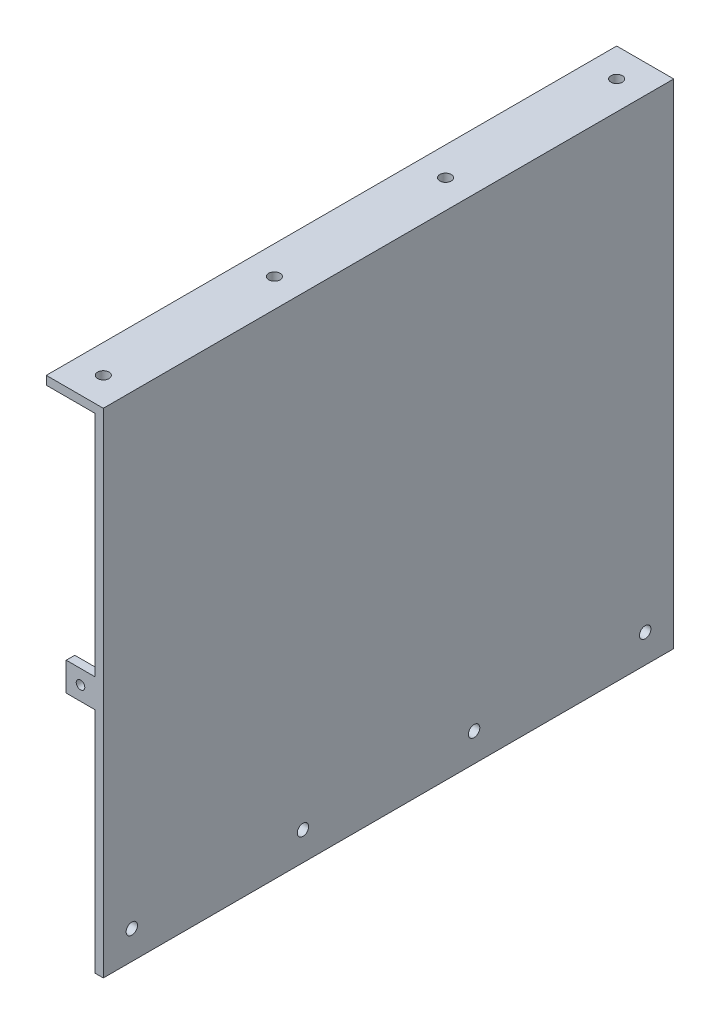
ISO-10303-21;
HEADER;
FILE_DESCRIPTION(('STEP AP214'),'2;1');
FILE_NAME('part.step','',(''),(''),'','','');
FILE_SCHEMA(('AUTOMOTIVE_DESIGN { 1 0 10303 214 1 1 1 1 }'));
ENDSEC;
DATA;
#1=APPLICATION_CONTEXT('core data for automotive mechanical design processes');
#2=APPLICATION_PROTOCOL_DEFINITION('international standard','automotive_design',2000,#1);
#3=PRODUCT_CONTEXT('',#1,'mechanical');
#4=PRODUCT('Part','Part','',(#3));
#5=PRODUCT_RELATED_PRODUCT_CATEGORY('part','',(#4));
#6=PRODUCT_DEFINITION_FORMATION('','',#4);
#7=PRODUCT_DEFINITION_CONTEXT('part definition',#1,'design');
#8=PRODUCT_DEFINITION('design','',#6,#7);
#9=PRODUCT_DEFINITION_SHAPE('','',#8);
#10=(LENGTH_UNIT() NAMED_UNIT(*) SI_UNIT(.MILLI.,.METRE.));
#11=(NAMED_UNIT(*) PLANE_ANGLE_UNIT() SI_UNIT($,.RADIAN.));
#12=(NAMED_UNIT(*) SI_UNIT($,.STERADIAN.) SOLID_ANGLE_UNIT());
#13=UNCERTAINTY_MEASURE_WITH_UNIT(LENGTH_MEASURE(1.E-05),#10,'distance_accuracy_value','');
#14=(GEOMETRIC_REPRESENTATION_CONTEXT(3) GLOBAL_UNCERTAINTY_ASSIGNED_CONTEXT((#13)) GLOBAL_UNIT_ASSIGNED_CONTEXT((#10,
#11,#12)) REPRESENTATION_CONTEXT('',''));
#15=CARTESIAN_POINT('',(0.,0.,0.));
#16=DIRECTION('',(0.,0.,1.));
#17=DIRECTION('',(1.,0.,0.));
#18=AXIS2_PLACEMENT_3D('',#15,#16,#17);
#19=CARTESIAN_POINT('',(7.,-170.,100.));
#20=DIRECTION('',(1.,0.,0.));
#21=DIRECTION('',(0.,0.,-1.));
#22=AXIS2_PLACEMENT_3D('',#19,#20,#21);
#23=PLANE('',#22);
#24=CARTESIAN_POINT('',(7.00000000000003,-160.,-90.));
#25=DIRECTION('',(1.,0.,0.));
#26=DIRECTION('',(0.,0.,-1.));
#27=AXIS2_PLACEMENT_3D('',#24,#25,#26);
#28=CIRCLE('',#27,2.);
#29=CARTESIAN_POINT('',(7.00000000000003,-160.,-92.));
#30=VERTEX_POINT('',#29);
#31=EDGE_CURVE('E271',#30,#30,#28,.F.);
#32=ORIENTED_EDGE('',*,*,#31,.F.);
#33=EDGE_LOOP('',(#32));
#34=FACE_BOUND('',#33,.T.);
#35=CARTESIAN_POINT('',(7.00000000000003,-160.,-30.));
#36=DIRECTION('',(1.,0.,0.));
#37=DIRECTION('',(0.,0.,-1.));
#38=AXIS2_PLACEMENT_3D('',#35,#36,#37);
#39=CIRCLE('',#38,2.);
#40=CARTESIAN_POINT('',(7.00000000000003,-160.,-32.));
#41=VERTEX_POINT('',#40);
#42=EDGE_CURVE('E263',#41,#41,#39,.F.);
#43=ORIENTED_EDGE('',*,*,#42,.F.);
#44=EDGE_LOOP('',(#43));
#45=FACE_BOUND('',#44,.T.);
#46=CARTESIAN_POINT('',(7.00000000000003,-160.,30.));
#47=DIRECTION('',(1.,0.,0.));
#48=DIRECTION('',(0.,0.,-1.));
#49=AXIS2_PLACEMENT_3D('',#46,#47,#48);
#50=CIRCLE('',#49,2.);
#51=CARTESIAN_POINT('',(7.00000000000003,-160.,28.));
#52=VERTEX_POINT('',#51);
#53=EDGE_CURVE('E255',#52,#52,#50,.F.);
#54=ORIENTED_EDGE('',*,*,#53,.F.);
#55=EDGE_LOOP('',(#54));
#56=FACE_BOUND('',#55,.T.);
#57=CARTESIAN_POINT('',(7.00000000000003,-160.,90.));
#58=DIRECTION('',(1.,0.,0.));
#59=DIRECTION('',(0.,0.,-1.));
#60=AXIS2_PLACEMENT_3D('',#57,#58,#59);
#61=CIRCLE('',#60,2.);
#62=CARTESIAN_POINT('',(7.00000000000003,-160.,88.));
#63=VERTEX_POINT('',#62);
#64=EDGE_CURVE('E247',#63,#63,#61,.F.);
#65=ORIENTED_EDGE('',*,*,#64,.F.);
#66=EDGE_LOOP('',(#65));
#67=FACE_BOUND('',#66,.T.);
#68=DIRECTION('',(0.,1.,0.));
#69=VECTOR('',#68,1.);
#70=CARTESIAN_POINT('',(7.00000000000003,-80.,97.));
#71=LINE('',#70,#69);
#72=CARTESIAN_POINT('',(7.,-90.,97.));
#73=VERTEX_POINT('',#72);
#74=CARTESIAN_POINT('',(7.,-80.,97.));
#75=VERTEX_POINT('',#74);
#76=EDGE_CURVE('E59',#73,#75,#71,.T.);
#77=ORIENTED_EDGE('',*,*,#76,.T.);
#78=DIRECTION('',(0.,0.,1.));
#79=VECTOR('',#78,1.);
#80=CARTESIAN_POINT('',(7.00000000000003,-80.,100.));
#81=LINE('',#80,#79);
#82=CARTESIAN_POINT('',(7.00000000000003,-80.,100.));
#83=VERTEX_POINT('',#82);
#84=EDGE_CURVE('E180',#75,#83,#81,.T.);
#85=ORIENTED_EDGE('',*,*,#84,.T.);
#86=DIRECTION('',(0.,1.,0.));
#87=VECTOR('',#86,1.);
#88=CARTESIAN_POINT('',(7.,-170.,100.));
#89=LINE('',#88,#87);
#90=CARTESIAN_POINT('',(7.00000000000002,0.,100.));
#91=VERTEX_POINT('',#90);
#92=EDGE_CURVE('E151',#83,#91,#89,.T.);
#93=ORIENTED_EDGE('',*,*,#92,.T.);
#94=DIRECTION('',(0.,0.,-1.));
#95=VECTOR('',#94,1.);
#96=CARTESIAN_POINT('',(7.,0.,100.));
#97=LINE('',#96,#95);
#98=CARTESIAN_POINT('',(7.00000000000003,0.,-100.));
#99=VERTEX_POINT('',#98);
#100=EDGE_CURVE('E304',#91,#99,#97,.T.);
#101=ORIENTED_EDGE('',*,*,#100,.T.);
#102=DIRECTION('',(0.,1.,0.));
#103=VECTOR('',#102,1.);
#104=CARTESIAN_POINT('',(7.00000000000003,-170.,-100.));
#105=LINE('',#104,#103);
#106=CARTESIAN_POINT('',(7.00000000000003,-80.,-100.));
#107=VERTEX_POINT('',#106);
#108=EDGE_CURVE('E322',#107,#99,#105,.T.);
#109=ORIENTED_EDGE('',*,*,#108,.F.);
#110=DIRECTION('',(0.,0.,-1.));
#111=VECTOR('',#110,1.);
#112=CARTESIAN_POINT('',(7.00000000000003,-80.,-100.));
#113=LINE('',#112,#111);
#114=CARTESIAN_POINT('',(7.00000000000003,-80.,-97.));
#115=VERTEX_POINT('',#114);
#116=EDGE_CURVE('E208',#115,#107,#113,.T.);
#117=ORIENTED_EDGE('',*,*,#116,.F.);
#118=DIRECTION('',(0.,1.,0.));
#119=VECTOR('',#118,1.);
#120=CARTESIAN_POINT('',(7.00000000000003,-80.,-97.));
#121=LINE('',#120,#119);
#122=CARTESIAN_POINT('',(7.00000000000003,-90.,-97.));
#123=VERTEX_POINT('',#122);
#124=EDGE_CURVE('E221',#123,#115,#121,.T.);
#125=ORIENTED_EDGE('',*,*,#124,.F.);
#126=DIRECTION('',(0.,0.,1.));
#127=VECTOR('',#126,1.);
#128=CARTESIAN_POINT('',(7.00000000000003,-90.,-100.));
#129=LINE('',#128,#127);
#130=CARTESIAN_POINT('',(7.00000000000003,-90.,-100.));
#131=VERTEX_POINT('',#130);
#132=EDGE_CURVE('E202',#131,#123,#129,.T.);
#133=ORIENTED_EDGE('',*,*,#132,.F.);
#134=CARTESIAN_POINT('',(7.00000000000003,-170.,-100.));
#135=VERTEX_POINT('',#134);
#136=EDGE_CURVE('E326',#135,#131,#105,.T.);
#137=ORIENTED_EDGE('',*,*,#136,.F.);
#138=DIRECTION('',(0.,0.,-1.));
#139=VECTOR('',#138,1.);
#140=CARTESIAN_POINT('',(7.,-170.,100.));
#141=LINE('',#140,#139);
#142=CARTESIAN_POINT('',(7.,-170.,100.));
#143=VERTEX_POINT('',#142);
#144=EDGE_CURVE('E315',#143,#135,#141,.T.);
#145=ORIENTED_EDGE('',*,*,#144,.F.);
#146=CARTESIAN_POINT('',(7.,-90.,100.));
#147=VERTEX_POINT('',#146);
#148=EDGE_CURVE('E330',#143,#147,#89,.T.);
#149=ORIENTED_EDGE('',*,*,#148,.T.);
#150=DIRECTION('',(0.,0.,-1.));
#151=VECTOR('',#150,1.);
#152=CARTESIAN_POINT('',(7.00000000000003,-90.,100.));
#153=LINE('',#152,#151);
#154=EDGE_CURVE('E64',#147,#73,#153,.T.);
#155=ORIENTED_EDGE('',*,*,#154,.T.);
#156=EDGE_LOOP('',(#77,#85,#93,#101,#109,#117,#125,#133,#137,#145,#149,#155));
#157=FACE_BOUND('',#156,.T.);
#158=ADVANCED_FACE('F43',(#34,#45,#56,#67,#157),#23,.F.);
#159=CARTESIAN_POINT('',(10.,3.,100.));
#160=DIRECTION('',(-1.,0.,0.));
#161=DIRECTION('',(0.,0.,1.));
#162=AXIS2_PLACEMENT_3D('',#159,#160,#161);
#163=PLANE('',#162);
#164=CARTESIAN_POINT('',(10.,-160.,90.));
#165=DIRECTION('',(1.,0.,0.));
#166=DIRECTION('',(0.,0.,-1.));
#167=AXIS2_PLACEMENT_3D('',#164,#165,#166);
#168=CIRCLE('',#167,2.);
#169=CARTESIAN_POINT('',(10.,-160.,88.));
#170=VERTEX_POINT('',#169);
#171=EDGE_CURVE('E243',#170,#170,#168,.T.);
#172=ORIENTED_EDGE('',*,*,#171,.F.);
#173=EDGE_LOOP('',(#172));
#174=FACE_BOUND('',#173,.T.);
#175=CARTESIAN_POINT('',(10.,-160.,30.));
#176=DIRECTION('',(1.,0.,0.));
#177=DIRECTION('',(0.,0.,-1.));
#178=AXIS2_PLACEMENT_3D('',#175,#176,#177);
#179=CIRCLE('',#178,2.);
#180=CARTESIAN_POINT('',(10.,-160.,28.));
#181=VERTEX_POINT('',#180);
#182=EDGE_CURVE('E251',#181,#181,#179,.T.);
#183=ORIENTED_EDGE('',*,*,#182,.F.);
#184=EDGE_LOOP('',(#183));
#185=FACE_BOUND('',#184,.T.);
#186=CARTESIAN_POINT('',(10.,-160.,-30.));
#187=DIRECTION('',(1.,0.,0.));
#188=DIRECTION('',(0.,0.,-1.));
#189=AXIS2_PLACEMENT_3D('',#186,#187,#188);
#190=CIRCLE('',#189,2.);
#191=CARTESIAN_POINT('',(10.,-160.,-32.));
#192=VERTEX_POINT('',#191);
#193=EDGE_CURVE('E259',#192,#192,#190,.T.);
#194=ORIENTED_EDGE('',*,*,#193,.F.);
#195=EDGE_LOOP('',(#194));
#196=FACE_BOUND('',#195,.T.);
#197=CARTESIAN_POINT('',(10.,-160.,-90.));
#198=DIRECTION('',(1.,0.,0.));
#199=DIRECTION('',(0.,0.,-1.));
#200=AXIS2_PLACEMENT_3D('',#197,#198,#199);
#201=CIRCLE('',#200,2.);
#202=CARTESIAN_POINT('',(10.,-160.,-92.));
#203=VERTEX_POINT('',#202);
#204=EDGE_CURVE('E267',#203,#203,#201,.T.);
#205=ORIENTED_EDGE('',*,*,#204,.F.);
#206=EDGE_LOOP('',(#205));
#207=FACE_BOUND('',#206,.T.);
#208=DIRECTION('',(0.,-1.,0.));
#209=VECTOR('',#208,1.);
#210=CARTESIAN_POINT('',(10.,3.,100.));
#211=LINE('',#210,#209);
#212=CARTESIAN_POINT('',(10.,3.,100.));
#213=VERTEX_POINT('',#212);
#214=CARTESIAN_POINT('',(10.,-170.,100.));
#215=VERTEX_POINT('',#214);
#216=EDGE_CURVE('E348',#213,#215,#211,.T.);
#217=ORIENTED_EDGE('',*,*,#216,.T.);
#218=DIRECTION('',(0.,0.,1.));
#219=VECTOR('',#218,1.);
#220=CARTESIAN_POINT('',(10.,-170.,100.));
#221=LINE('',#220,#219);
#222=CARTESIAN_POINT('',(10.,-170.,-100.));
#223=VERTEX_POINT('',#222);
#224=EDGE_CURVE('E308',#223,#215,#221,.T.);
#225=ORIENTED_EDGE('',*,*,#224,.F.);
#226=DIRECTION('',(0.,-1.,0.));
#227=VECTOR('',#226,1.);
#228=CARTESIAN_POINT('',(10.,3.,-100.));
#229=LINE('',#228,#227);
#230=CARTESIAN_POINT('',(10.,3.,-100.));
#231=VERTEX_POINT('',#230);
#232=EDGE_CURVE('E11',#231,#223,#229,.T.);
#233=ORIENTED_EDGE('',*,*,#232,.F.);
#234=DIRECTION('',(0.,0.,-1.));
#235=VECTOR('',#234,1.);
#236=CARTESIAN_POINT('',(10.,3.,100.));
#237=LINE('',#236,#235);
#238=EDGE_CURVE('E334',#213,#231,#237,.T.);
#239=ORIENTED_EDGE('',*,*,#238,.F.);
#240=EDGE_LOOP('',(#217,#225,#233,#239));
#241=FACE_BOUND('',#240,.T.);
#242=ADVANCED_FACE('F45',(#174,#185,#196,#207,#241),#163,.F.);
#243=CARTESIAN_POINT('',(-10.,3.,-100.));
#244=DIRECTION('',(0.,0.,1.));
#245=DIRECTION('',(1.,0.,0.));
#246=AXIS2_PLACEMENT_3D('',#243,#244,#245);
#247=PLANE('',#246);
#248=CARTESIAN_POINT('',(2.00000000000003,-85.,-100.));
#249=DIRECTION('',(0.,0.,-1.));
#250=DIRECTION('',(-1.,0.,0.));
#251=AXIS2_PLACEMENT_3D('',#248,#249,#250);
#252=CIRCLE('',#251,1.5);
#253=CARTESIAN_POINT('',(0.500000000000026,-85.,-100.));
#254=VERTEX_POINT('',#253);
#255=EDGE_CURVE('E156',#254,#254,#252,.T.);
#256=ORIENTED_EDGE('',*,*,#255,.F.);
#257=EDGE_LOOP('',(#256));
#258=FACE_BOUND('',#257,.T.);
#259=ORIENTED_EDGE('',*,*,#232,.T.);
#260=DIRECTION('',(1.,0.,0.));
#261=VECTOR('',#260,1.);
#262=CARTESIAN_POINT('',(10.,-170.,-100.));
#263=LINE('',#262,#261);
#264=EDGE_CURVE('E318',#135,#223,#263,.T.);
#265=ORIENTED_EDGE('',*,*,#264,.F.);
#266=ORIENTED_EDGE('',*,*,#136,.T.);
#267=DIRECTION('',(1.,0.,0.));
#268=VECTOR('',#267,1.);
#269=CARTESIAN_POINT('',(-2.99999999999997,-90.,-100.));
#270=LINE('',#269,#268);
#271=CARTESIAN_POINT('',(-2.99999999999997,-90.,-100.));
#272=VERTEX_POINT('',#271);
#273=EDGE_CURVE('E239',#272,#131,#270,.T.);
#274=ORIENTED_EDGE('',*,*,#273,.F.);
#275=DIRECTION('',(0.,-1.,0.));
#276=VECTOR('',#275,1.);
#277=CARTESIAN_POINT('',(-2.99999999999997,-80.,-100.));
#278=LINE('',#277,#276);
#279=CARTESIAN_POINT('',(-2.99999999999997,-80.,-100.));
#280=VERTEX_POINT('',#279);
#281=EDGE_CURVE('E203',#280,#272,#278,.T.);
#282=ORIENTED_EDGE('',*,*,#281,.F.);
#283=DIRECTION('',(1.,0.,0.));
#284=VECTOR('',#283,1.);
#285=CARTESIAN_POINT('',(-2.99999999999997,-80.,-100.));
#286=LINE('',#285,#284);
#287=EDGE_CURVE('E217',#280,#107,#286,.T.);
#288=ORIENTED_EDGE('',*,*,#287,.T.);
#289=ORIENTED_EDGE('',*,*,#108,.T.);
#290=DIRECTION('',(-1.,0.,0.));
#291=VECTOR('',#290,1.);
#292=CARTESIAN_POINT('',(-10.,0.,-100.));
#293=LINE('',#292,#291);
#294=CARTESIAN_POINT('',(-10.,0.,-100.));
#295=VERTEX_POINT('',#294);
#296=EDGE_CURVE('E333',#99,#295,#293,.T.);
#297=ORIENTED_EDGE('',*,*,#296,.T.);
#298=DIRECTION('',(0.,-1.,0.));
#299=VECTOR('',#298,1.);
#300=CARTESIAN_POINT('',(-10.,3.,-100.));
#301=LINE('',#300,#299);
#302=CARTESIAN_POINT('',(-10.,3.,-100.));
#303=VERTEX_POINT('',#302);
#304=EDGE_CURVE('E52',#303,#295,#301,.T.);
#305=ORIENTED_EDGE('',*,*,#304,.F.);
#306=DIRECTION('',(-1.,0.,0.));
#307=VECTOR('',#306,1.);
#308=CARTESIAN_POINT('',(-10.,3.,-100.));
#309=LINE('',#308,#307);
#310=EDGE_CURVE('E338',#231,#303,#309,.T.);
#311=ORIENTED_EDGE('',*,*,#310,.F.);
#312=EDGE_LOOP('',(#259,#265,#266,#274,#282,#288,#289,#297,#305,#311));
#313=FACE_BOUND('',#312,.T.);
#314=ADVANCED_FACE('F382',(#258,#313),#247,.F.);
#315=CARTESIAN_POINT('',(-10.,3.,100.));
#316=DIRECTION('',(1.,0.,0.));
#317=DIRECTION('',(0.,0.,-1.));
#318=AXIS2_PLACEMENT_3D('',#315,#316,#317);
#319=PLANE('',#318);
#320=DIRECTION('',(0.,0.,1.));
#321=VECTOR('',#320,1.);
#322=CARTESIAN_POINT('',(-10.,0.,100.));
#323=LINE('',#322,#321);
#324=CARTESIAN_POINT('',(-10.,0.,100.));
#325=VERTEX_POINT('',#324);
#326=EDGE_CURVE('E351',#295,#325,#323,.T.);
#327=ORIENTED_EDGE('',*,*,#326,.T.);
#328=DIRECTION('',(0.,-1.,0.));
#329=VECTOR('',#328,1.);
#330=CARTESIAN_POINT('',(-10.,3.,100.));
#331=LINE('',#330,#329);
#332=CARTESIAN_POINT('',(-10.,3.,100.));
#333=VERTEX_POINT('',#332);
#334=EDGE_CURVE('E358',#333,#325,#331,.T.);
#335=ORIENTED_EDGE('',*,*,#334,.F.);
#336=DIRECTION('',(0.,0.,1.));
#337=VECTOR('',#336,1.);
#338=CARTESIAN_POINT('',(-10.,3.,100.));
#339=LINE('',#338,#337);
#340=EDGE_CURVE('E342',#303,#333,#339,.T.);
#341=ORIENTED_EDGE('',*,*,#340,.F.);
#342=ORIENTED_EDGE('',*,*,#304,.T.);
#343=EDGE_LOOP('',(#327,#335,#341,#342));
#344=FACE_BOUND('',#343,.T.);
#345=ADVANCED_FACE('F367',(#344),#319,.F.);
#346=CARTESIAN_POINT('',(-10.,3.,100.));
#347=DIRECTION('',(0.,0.,-1.));
#348=DIRECTION('',(-1.,0.,0.));
#349=AXIS2_PLACEMENT_3D('',#346,#347,#348);
#350=PLANE('',#349);
#351=CARTESIAN_POINT('',(2.00000000000003,-85.,100.));
#352=DIRECTION('',(0.,0.,-1.));
#353=DIRECTION('',(-1.,0.,0.));
#354=AXIS2_PLACEMENT_3D('',#351,#352,#353);
#355=CIRCLE('',#354,1.5);
#356=CARTESIAN_POINT('',(0.500000000000026,-85.,100.));
#357=VERTEX_POINT('',#356);
#358=EDGE_CURVE('E478',#357,#357,#355,.T.);
#359=ORIENTED_EDGE('',*,*,#358,.T.);
#360=EDGE_LOOP('',(#359));
#361=FACE_BOUND('',#360,.T.);
#362=DIRECTION('',(1.,0.,0.));
#363=VECTOR('',#362,1.);
#364=CARTESIAN_POINT('',(-10.,0.,100.));
#365=LINE('',#364,#363);
#366=EDGE_CURVE('E339',#325,#91,#365,.T.);
#367=ORIENTED_EDGE('',*,*,#366,.T.);
#368=ORIENTED_EDGE('',*,*,#92,.F.);
#369=DIRECTION('',(1.,0.,0.));
#370=VECTOR('',#369,1.);
#371=CARTESIAN_POINT('',(-2.99999999999997,-80.,100.));
#372=LINE('',#371,#370);
#373=CARTESIAN_POINT('',(-2.99999999999997,-80.,100.));
#374=VERTEX_POINT('',#373);
#375=EDGE_CURVE('E144',#374,#83,#372,.T.);
#376=ORIENTED_EDGE('',*,*,#375,.F.);
#377=DIRECTION('',(0.,-1.,0.));
#378=VECTOR('',#377,1.);
#379=CARTESIAN_POINT('',(-2.99999999999997,-80.,100.));
#380=LINE('',#379,#378);
#381=CARTESIAN_POINT('',(-2.99999999999997,-90.,100.));
#382=VERTEX_POINT('',#381);
#383=EDGE_CURVE('E149',#374,#382,#380,.T.);
#384=ORIENTED_EDGE('',*,*,#383,.T.);
#385=DIRECTION('',(1.,0.,0.));
#386=VECTOR('',#385,1.);
#387=CARTESIAN_POINT('',(-2.99999999999997,-90.,100.));
#388=LINE('',#387,#386);
#389=EDGE_CURVE('E179',#382,#147,#388,.T.);
#390=ORIENTED_EDGE('',*,*,#389,.T.);
#391=ORIENTED_EDGE('',*,*,#148,.F.);
#392=DIRECTION('',(-1.,0.,0.));
#393=VECTOR('',#392,1.);
#394=CARTESIAN_POINT('',(10.,-170.,100.));
#395=LINE('',#394,#393);
#396=EDGE_CURVE('E312',#215,#143,#395,.T.);
#397=ORIENTED_EDGE('',*,*,#396,.F.);
#398=ORIENTED_EDGE('',*,*,#216,.F.);
#399=DIRECTION('',(1.,0.,0.));
#400=VECTOR('',#399,1.);
#401=CARTESIAN_POINT('',(-10.,3.,100.));
#402=LINE('',#401,#400);
#403=EDGE_CURVE('E345',#333,#213,#402,.T.);
#404=ORIENTED_EDGE('',*,*,#403,.F.);
#405=ORIENTED_EDGE('',*,*,#334,.T.);
#406=EDGE_LOOP('',(#367,#368,#376,#384,#390,#391,#397,#398,#404,#405));
#407=FACE_BOUND('',#406,.T.);
#408=ADVANCED_FACE('F147',(#361,#407),#350,.F.);
#409=CARTESIAN_POINT('',(0.,3.,0.));
#410=DIRECTION('',(0.,-1.,0.));
#411=DIRECTION('',(0.,0.,-1.));
#412=AXIS2_PLACEMENT_3D('',#409,#410,#411);
#413=PLANE('',#412);
#414=CARTESIAN_POINT('',(0.,3.,-90.));
#415=DIRECTION('',(0.,1.,0.));
#416=DIRECTION('',(0.,0.,1.));
#417=AXIS2_PLACEMENT_3D('',#414,#415,#416);
#418=CIRCLE('',#417,2.);
#419=CARTESIAN_POINT('',(0.,3.,-88.));
#420=VERTEX_POINT('',#419);
#421=EDGE_CURVE('E279',#420,#420,#418,.T.);
#422=ORIENTED_EDGE('',*,*,#421,.F.);
#423=EDGE_LOOP('',(#422));
#424=FACE_BOUND('',#423,.T.);
#425=CARTESIAN_POINT('',(0.,3.,-30.));
#426=DIRECTION('',(0.,1.,0.));
#427=DIRECTION('',(0.,0.,1.));
#428=AXIS2_PLACEMENT_3D('',#425,#426,#427);
#429=CIRCLE('',#428,2.);
#430=CARTESIAN_POINT('',(0.,3.,-28.));
#431=VERTEX_POINT('',#430);
#432=EDGE_CURVE('E287',#431,#431,#429,.T.);
#433=ORIENTED_EDGE('',*,*,#432,.F.);
#434=EDGE_LOOP('',(#433));
#435=FACE_BOUND('',#434,.T.);
#436=CARTESIAN_POINT('',(0.,3.,30.));
#437=DIRECTION('',(0.,1.,0.));
#438=DIRECTION('',(0.,0.,1.));
#439=AXIS2_PLACEMENT_3D('',#436,#437,#438);
#440=CIRCLE('',#439,2.);
#441=CARTESIAN_POINT('',(0.,3.,32.));
#442=VERTEX_POINT('',#441);
#443=EDGE_CURVE('E295',#442,#442,#440,.T.);
#444=ORIENTED_EDGE('',*,*,#443,.F.);
#445=EDGE_LOOP('',(#444));
#446=FACE_BOUND('',#445,.T.);
#447=CARTESIAN_POINT('',(0.,3.,90.));
#448=DIRECTION('',(0.,1.,0.));
#449=DIRECTION('',(0.,0.,1.));
#450=AXIS2_PLACEMENT_3D('',#447,#448,#449);
#451=CIRCLE('',#450,2.);
#452=CARTESIAN_POINT('',(0.,3.,92.));
#453=VERTEX_POINT('',#452);
#454=EDGE_CURVE('E300',#453,#453,#451,.T.);
#455=ORIENTED_EDGE('',*,*,#454,.F.);
#456=EDGE_LOOP('',(#455));
#457=FACE_BOUND('',#456,.T.);
#458=ORIENTED_EDGE('',*,*,#238,.T.);
#459=ORIENTED_EDGE('',*,*,#310,.T.);
#460=ORIENTED_EDGE('',*,*,#340,.T.);
#461=ORIENTED_EDGE('',*,*,#403,.T.);
#462=EDGE_LOOP('',(#458,#459,#460,#461));
#463=FACE_BOUND('',#462,.T.);
#464=ADVANCED_FACE('F380',(#424,#435,#446,#457,#463),#413,.F.);
#465=CARTESIAN_POINT('',(0.,0.,0.));
#466=DIRECTION('',(0.,-1.,0.));
#467=DIRECTION('',(0.,0.,-1.));
#468=AXIS2_PLACEMENT_3D('',#465,#466,#467);
#469=PLANE('',#468);
#470=CARTESIAN_POINT('',(0.,0.,-90.));
#471=DIRECTION('',(0.,-1.,0.));
#472=DIRECTION('',(0.,0.,-1.));
#473=AXIS2_PLACEMENT_3D('',#470,#471,#472);
#474=CIRCLE('',#473,2.);
#475=CARTESIAN_POINT('',(0.,0.,-92.));
#476=VERTEX_POINT('',#475);
#477=EDGE_CURVE('E275',#476,#476,#474,.F.);
#478=ORIENTED_EDGE('',*,*,#477,.T.);
#479=EDGE_LOOP('',(#478));
#480=FACE_BOUND('',#479,.T.);
#481=CARTESIAN_POINT('',(0.,0.,-30.));
#482=DIRECTION('',(0.,-1.,0.));
#483=DIRECTION('',(0.,0.,-1.));
#484=AXIS2_PLACEMENT_3D('',#481,#482,#483);
#485=CIRCLE('',#484,2.);
#486=CARTESIAN_POINT('',(0.,0.,-32.));
#487=VERTEX_POINT('',#486);
#488=EDGE_CURVE('E283',#487,#487,#485,.F.);
#489=ORIENTED_EDGE('',*,*,#488,.T.);
#490=EDGE_LOOP('',(#489));
#491=FACE_BOUND('',#490,.T.);
#492=CARTESIAN_POINT('',(0.,0.,30.));
#493=DIRECTION('',(0.,-1.,0.));
#494=DIRECTION('',(0.,0.,-1.));
#495=AXIS2_PLACEMENT_3D('',#492,#493,#494);
#496=CIRCLE('',#495,2.);
#497=CARTESIAN_POINT('',(0.,0.,28.));
#498=VERTEX_POINT('',#497);
#499=EDGE_CURVE('E291',#498,#498,#496,.F.);
#500=ORIENTED_EDGE('',*,*,#499,.T.);
#501=EDGE_LOOP('',(#500));
#502=FACE_BOUND('',#501,.T.);
#503=CARTESIAN_POINT('',(0.,0.,90.));
#504=DIRECTION('',(0.,-1.,0.));
#505=DIRECTION('',(0.,0.,-1.));
#506=AXIS2_PLACEMENT_3D('',#503,#504,#505);
#507=CIRCLE('',#506,2.);
#508=CARTESIAN_POINT('',(0.,0.,88.));
#509=VERTEX_POINT('',#508);
#510=EDGE_CURVE('E299',#509,#509,#507,.F.);
#511=ORIENTED_EDGE('',*,*,#510,.T.);
#512=EDGE_LOOP('',(#511));
#513=FACE_BOUND('',#512,.T.);
#514=ORIENTED_EDGE('',*,*,#100,.F.);
#515=ORIENTED_EDGE('',*,*,#366,.F.);
#516=ORIENTED_EDGE('',*,*,#326,.F.);
#517=ORIENTED_EDGE('',*,*,#296,.F.);
#518=EDGE_LOOP('',(#514,#515,#516,#517));
#519=FACE_BOUND('',#518,.T.);
#520=ADVANCED_FACE('F374',(#480,#491,#502,#513,#519),#469,.T.);
#521=CARTESIAN_POINT('',(0.,-170.,0.));
#522=DIRECTION('',(0.,1.,0.));
#523=DIRECTION('',(0.,0.,1.));
#524=AXIS2_PLACEMENT_3D('',#521,#522,#523);
#525=PLANE('',#524);
#526=ORIENTED_EDGE('',*,*,#224,.T.);
#527=ORIENTED_EDGE('',*,*,#396,.T.);
#528=ORIENTED_EDGE('',*,*,#144,.T.);
#529=ORIENTED_EDGE('',*,*,#264,.T.);
#530=EDGE_LOOP('',(#526,#527,#528,#529));
#531=FACE_BOUND('',#530,.T.);
#532=ADVANCED_FACE('F387',(#531),#525,.F.);
#533=CARTESIAN_POINT('',(0.,-170.001,90.));
#534=DIRECTION('',(0.,1.,0.));
#535=DIRECTION('',(0.,0.,1.));
#536=AXIS2_PLACEMENT_3D('',#533,#534,#535);
#537=CYLINDRICAL_SURFACE('',#536,2.);
#538=ORIENTED_EDGE('',*,*,#510,.F.);
#539=EDGE_LOOP('',(#538));
#540=FACE_BOUND('',#539,.T.);
#541=ORIENTED_EDGE('',*,*,#454,.T.);
#542=EDGE_LOOP('',(#541));
#543=FACE_BOUND('',#542,.T.);
#544=ADVANCED_FACE('F632',(#540,#543),#537,.F.);
#545=CARTESIAN_POINT('',(0.,-170.001,30.));
#546=DIRECTION('',(0.,1.,0.));
#547=DIRECTION('',(0.,0.,1.));
#548=AXIS2_PLACEMENT_3D('',#545,#546,#547);
#549=CYLINDRICAL_SURFACE('',#548,2.);
#550=ORIENTED_EDGE('',*,*,#499,.F.);
#551=EDGE_LOOP('',(#550));
#552=FACE_BOUND('',#551,.T.);
#553=ORIENTED_EDGE('',*,*,#443,.T.);
#554=EDGE_LOOP('',(#553));
#555=FACE_BOUND('',#554,.T.);
#556=ADVANCED_FACE('F622',(#552,#555),#549,.F.);
#557=CARTESIAN_POINT('',(0.,-170.001,-30.));
#558=DIRECTION('',(0.,1.,0.));
#559=DIRECTION('',(0.,0.,1.));
#560=AXIS2_PLACEMENT_3D('',#557,#558,#559);
#561=CYLINDRICAL_SURFACE('',#560,2.);
#562=ORIENTED_EDGE('',*,*,#488,.F.);
#563=EDGE_LOOP('',(#562));
#564=FACE_BOUND('',#563,.T.);
#565=ORIENTED_EDGE('',*,*,#432,.T.);
#566=EDGE_LOOP('',(#565));
#567=FACE_BOUND('',#566,.T.);
#568=ADVANCED_FACE('F612',(#564,#567),#561,.F.);
#569=CARTESIAN_POINT('',(0.,-170.001,-90.));
#570=DIRECTION('',(0.,1.,0.));
#571=DIRECTION('',(0.,0.,1.));
#572=AXIS2_PLACEMENT_3D('',#569,#570,#571);
#573=CYLINDRICAL_SURFACE('',#572,2.);
#574=ORIENTED_EDGE('',*,*,#477,.F.);
#575=EDGE_LOOP('',(#574));
#576=FACE_BOUND('',#575,.T.);
#577=ORIENTED_EDGE('',*,*,#421,.T.);
#578=EDGE_LOOP('',(#577));
#579=FACE_BOUND('',#578,.T.);
#580=ADVANCED_FACE('F602',(#576,#579),#573,.F.);
#581=CARTESIAN_POINT('',(-10.001,-160.,-90.));
#582=DIRECTION('',(1.,0.,0.));
#583=DIRECTION('',(0.,0.,-1.));
#584=AXIS2_PLACEMENT_3D('',#581,#582,#583);
#585=CYLINDRICAL_SURFACE('',#584,2.);
#586=ORIENTED_EDGE('',*,*,#204,.T.);
#587=EDGE_LOOP('',(#586));
#588=FACE_BOUND('',#587,.T.);
#589=ORIENTED_EDGE('',*,*,#31,.T.);
#590=EDGE_LOOP('',(#589));
#591=FACE_BOUND('',#590,.T.);
#592=ADVANCED_FACE('F592',(#588,#591),#585,.F.);
#593=CARTESIAN_POINT('',(-10.001,-160.,-30.));
#594=DIRECTION('',(1.,0.,0.));
#595=DIRECTION('',(0.,0.,-1.));
#596=AXIS2_PLACEMENT_3D('',#593,#594,#595);
#597=CYLINDRICAL_SURFACE('',#596,2.);
#598=ORIENTED_EDGE('',*,*,#193,.T.);
#599=EDGE_LOOP('',(#598));
#600=FACE_BOUND('',#599,.T.);
#601=ORIENTED_EDGE('',*,*,#42,.T.);
#602=EDGE_LOOP('',(#601));
#603=FACE_BOUND('',#602,.T.);
#604=ADVANCED_FACE('F582',(#600,#603),#597,.F.);
#605=CARTESIAN_POINT('',(-10.001,-160.,30.));
#606=DIRECTION('',(1.,0.,0.));
#607=DIRECTION('',(0.,0.,-1.));
#608=AXIS2_PLACEMENT_3D('',#605,#606,#607);
#609=CYLINDRICAL_SURFACE('',#608,2.);
#610=ORIENTED_EDGE('',*,*,#182,.T.);
#611=EDGE_LOOP('',(#610));
#612=FACE_BOUND('',#611,.T.);
#613=ORIENTED_EDGE('',*,*,#53,.T.);
#614=EDGE_LOOP('',(#613));
#615=FACE_BOUND('',#614,.T.);
#616=ADVANCED_FACE('F572',(#612,#615),#609,.F.);
#617=CARTESIAN_POINT('',(-10.001,-160.,90.));
#618=DIRECTION('',(1.,0.,0.));
#619=DIRECTION('',(0.,0.,-1.));
#620=AXIS2_PLACEMENT_3D('',#617,#618,#619);
#621=CYLINDRICAL_SURFACE('',#620,2.);
#622=ORIENTED_EDGE('',*,*,#171,.T.);
#623=EDGE_LOOP('',(#622));
#624=FACE_BOUND('',#623,.T.);
#625=ORIENTED_EDGE('',*,*,#64,.T.);
#626=EDGE_LOOP('',(#625));
#627=FACE_BOUND('',#626,.T.);
#628=ADVANCED_FACE('F414',(#624,#627),#621,.F.);
#629=CARTESIAN_POINT('',(-2.99999999999997,-90.,-100.));
#630=DIRECTION('',(0.,1.,0.));
#631=DIRECTION('',(0.,0.,1.));
#632=AXIS2_PLACEMENT_3D('',#629,#630,#631);
#633=PLANE('',#632);
#634=ORIENTED_EDGE('',*,*,#132,.T.);
#635=DIRECTION('',(1.,0.,0.));
#636=VECTOR('',#635,1.);
#637=CARTESIAN_POINT('',(-2.99999999999997,-90.,-97.));
#638=LINE('',#637,#636);
#639=CARTESIAN_POINT('',(-2.99999999999997,-90.,-97.));
#640=VERTEX_POINT('',#639);
#641=EDGE_CURVE('E235',#640,#123,#638,.T.);
#642=ORIENTED_EDGE('',*,*,#641,.F.);
#643=DIRECTION('',(0.,0.,1.));
#644=VECTOR('',#643,1.);
#645=CARTESIAN_POINT('',(-2.99999999999997,-90.,-100.));
#646=LINE('',#645,#644);
#647=EDGE_CURVE('E207',#272,#640,#646,.T.);
#648=ORIENTED_EDGE('',*,*,#647,.F.);
#649=ORIENTED_EDGE('',*,*,#273,.T.);
#650=EDGE_LOOP('',(#634,#642,#648,#649));
#651=FACE_BOUND('',#650,.T.);
#652=ADVANCED_FACE('F394',(#651),#633,.F.);
#653=CARTESIAN_POINT('',(-2.99999999999997,-80.,-97.));
#654=DIRECTION('',(0.,0.,-1.));
#655=DIRECTION('',(-1.,0.,0.));
#656=AXIS2_PLACEMENT_3D('',#653,#654,#655);
#657=PLANE('',#656);
#658=CARTESIAN_POINT('',(2.00000000000003,-85.,-97.));
#659=DIRECTION('',(0.,0.,-1.));
#660=DIRECTION('',(-1.,0.,0.));
#661=AXIS2_PLACEMENT_3D('',#658,#659,#660);
#662=CIRCLE('',#661,1.5);
#663=CARTESIAN_POINT('',(0.500000000000026,-85.,-97.));
#664=VERTEX_POINT('',#663);
#665=EDGE_CURVE('E198',#664,#664,#662,.F.);
#666=ORIENTED_EDGE('',*,*,#665,.F.);
#667=EDGE_LOOP('',(#666));
#668=FACE_BOUND('',#667,.T.);
#669=ORIENTED_EDGE('',*,*,#124,.T.);
#670=DIRECTION('',(1.,0.,0.));
#671=VECTOR('',#670,1.);
#672=CARTESIAN_POINT('',(-2.99999999999997,-80.,-97.));
#673=LINE('',#672,#671);
#674=CARTESIAN_POINT('',(-2.99999999999997,-80.,-97.));
#675=VERTEX_POINT('',#674);
#676=EDGE_CURVE('E231',#675,#115,#673,.T.);
#677=ORIENTED_EDGE('',*,*,#676,.F.);
#678=DIRECTION('',(0.,1.,0.));
#679=VECTOR('',#678,1.);
#680=CARTESIAN_POINT('',(-2.99999999999997,-80.,-97.));
#681=LINE('',#680,#679);
#682=EDGE_CURVE('E211',#640,#675,#681,.T.);
#683=ORIENTED_EDGE('',*,*,#682,.F.);
#684=ORIENTED_EDGE('',*,*,#641,.T.);
#685=EDGE_LOOP('',(#669,#677,#683,#684));
#686=FACE_BOUND('',#685,.T.);
#687=ADVANCED_FACE('F405',(#668,#686),#657,.F.);
#688=CARTESIAN_POINT('',(-2.99999999999997,-80.,-100.));
#689=DIRECTION('',(0.,-1.,0.));
#690=DIRECTION('',(0.,0.,-1.));
#691=AXIS2_PLACEMENT_3D('',#688,#689,#690);
#692=PLANE('',#691);
#693=ORIENTED_EDGE('',*,*,#116,.T.);
#694=ORIENTED_EDGE('',*,*,#287,.F.);
#695=DIRECTION('',(0.,0.,-1.));
#696=VECTOR('',#695,1.);
#697=CARTESIAN_POINT('',(-2.99999999999997,-80.,-100.));
#698=LINE('',#697,#696);
#699=EDGE_CURVE('E214',#675,#280,#698,.T.);
#700=ORIENTED_EDGE('',*,*,#699,.F.);
#701=ORIENTED_EDGE('',*,*,#676,.T.);
#702=EDGE_LOOP('',(#693,#694,#700,#701));
#703=FACE_BOUND('',#702,.T.);
#704=ADVANCED_FACE('F402',(#703),#692,.F.);
#705=CARTESIAN_POINT('',(-2.99999999999997,0.,0.));
#706=DIRECTION('',(-1.,0.,0.));
#707=DIRECTION('',(0.,0.,1.));
#708=AXIS2_PLACEMENT_3D('',#705,#706,#707);
#709=PLANE('',#708);
#710=ORIENTED_EDGE('',*,*,#281,.T.);
#711=ORIENTED_EDGE('',*,*,#647,.T.);
#712=ORIENTED_EDGE('',*,*,#682,.T.);
#713=ORIENTED_EDGE('',*,*,#699,.T.);
#714=EDGE_LOOP('',(#710,#711,#712,#713));
#715=FACE_BOUND('',#714,.T.);
#716=ADVANCED_FACE('F398',(#715),#709,.T.);
#717=CARTESIAN_POINT('',(2.00000000000003,-85.,100.001));
#718=DIRECTION('',(0.,0.,-1.));
#719=DIRECTION('',(-1.,0.,0.));
#720=AXIS2_PLACEMENT_3D('',#717,#718,#719);
#721=CYLINDRICAL_SURFACE('',#720,1.5);
#722=ORIENTED_EDGE('',*,*,#255,.T.);
#723=EDGE_LOOP('',(#722));
#724=FACE_BOUND('',#723,.T.);
#725=ORIENTED_EDGE('',*,*,#665,.T.);
#726=EDGE_LOOP('',(#725));
#727=FACE_BOUND('',#726,.T.);
#728=ADVANCED_FACE('F448',(#724,#727),#721,.F.);
#729=CARTESIAN_POINT('',(-2.99999999999997,-80.,100.));
#730=DIRECTION('',(0.,1.,0.));
#731=DIRECTION('',(0.,0.,1.));
#732=AXIS2_PLACEMENT_3D('',#729,#730,#731);
#733=PLANE('',#732);
#734=ORIENTED_EDGE('',*,*,#84,.F.);
#735=DIRECTION('',(1.,0.,0.));
#736=VECTOR('',#735,1.);
#737=CARTESIAN_POINT('',(-2.99999999999997,-80.,97.));
#738=LINE('',#737,#736);
#739=CARTESIAN_POINT('',(-2.99999999999997,-80.,97.));
#740=VERTEX_POINT('',#739);
#741=EDGE_CURVE('E157',#740,#75,#738,.T.);
#742=ORIENTED_EDGE('',*,*,#741,.F.);
#743=DIRECTION('',(0.,0.,1.));
#744=VECTOR('',#743,1.);
#745=CARTESIAN_POINT('',(-2.99999999999997,-80.,100.));
#746=LINE('',#745,#744);
#747=EDGE_CURVE('E163',#740,#374,#746,.T.);
#748=ORIENTED_EDGE('',*,*,#747,.T.);
#749=ORIENTED_EDGE('',*,*,#375,.T.);
#750=EDGE_LOOP('',(#734,#742,#748,#749));
#751=FACE_BOUND('',#750,.T.);
#752=ADVANCED_FACE('F169',(#751),#733,.T.);
#753=CARTESIAN_POINT('',(-2.99999999999997,-80.,97.));
#754=DIRECTION('',(0.,0.,-1.));
#755=DIRECTION('',(-1.,0.,0.));
#756=AXIS2_PLACEMENT_3D('',#753,#754,#755);
#757=PLANE('',#756);
#758=CARTESIAN_POINT('',(2.00000000000003,-85.,97.));
#759=DIRECTION('',(0.,0.,-1.));
#760=DIRECTION('',(-1.,0.,0.));
#761=AXIS2_PLACEMENT_3D('',#758,#759,#760);
#762=CIRCLE('',#761,1.5);
#763=CARTESIAN_POINT('',(0.500000000000026,-85.,97.));
#764=VERTEX_POINT('',#763);
#765=EDGE_CURVE('E183',#764,#764,#762,.T.);
#766=ORIENTED_EDGE('',*,*,#765,.F.);
#767=EDGE_LOOP('',(#766));
#768=FACE_BOUND('',#767,.T.);
#769=ORIENTED_EDGE('',*,*,#76,.F.);
#770=DIRECTION('',(1.,0.,0.));
#771=VECTOR('',#770,1.);
#772=CARTESIAN_POINT('',(-2.99999999999997,-90.,97.));
#773=LINE('',#772,#771);
#774=CARTESIAN_POINT('',(-2.99999999999997,-90.,97.));
#775=VERTEX_POINT('',#774);
#776=EDGE_CURVE('E190',#775,#73,#773,.T.);
#777=ORIENTED_EDGE('',*,*,#776,.F.);
#778=DIRECTION('',(0.,1.,0.));
#779=VECTOR('',#778,1.);
#780=CARTESIAN_POINT('',(-2.99999999999997,-80.,97.));
#781=LINE('',#780,#779);
#782=EDGE_CURVE('E171',#775,#740,#781,.T.);
#783=ORIENTED_EDGE('',*,*,#782,.T.);
#784=ORIENTED_EDGE('',*,*,#741,.T.);
#785=EDGE_LOOP('',(#769,#777,#783,#784));
#786=FACE_BOUND('',#785,.T.);
#787=ADVANCED_FACE('F455',(#768,#786),#757,.T.);
#788=CARTESIAN_POINT('',(-2.99999999999997,-90.,100.));
#789=DIRECTION('',(0.,-1.,0.));
#790=DIRECTION('',(0.,0.,-1.));
#791=AXIS2_PLACEMENT_3D('',#788,#789,#790);
#792=PLANE('',#791);
#793=ORIENTED_EDGE('',*,*,#154,.F.);
#794=ORIENTED_EDGE('',*,*,#389,.F.);
#795=DIRECTION('',(0.,0.,-1.));
#796=VECTOR('',#795,1.);
#797=CARTESIAN_POINT('',(-2.99999999999997,-90.,100.));
#798=LINE('',#797,#796);
#799=EDGE_CURVE('E166',#382,#775,#798,.T.);
#800=ORIENTED_EDGE('',*,*,#799,.T.);
#801=ORIENTED_EDGE('',*,*,#776,.T.);
#802=EDGE_LOOP('',(#793,#794,#800,#801));
#803=FACE_BOUND('',#802,.T.);
#804=ADVANCED_FACE('F461',(#803),#792,.T.);
#805=CARTESIAN_POINT('',(-2.99999999999997,0.,0.));
#806=DIRECTION('',(-1.,0.,0.));
#807=DIRECTION('',(0.,0.,-1.));
#808=AXIS2_PLACEMENT_3D('',#805,#806,#807);
#809=PLANE('',#808);
#810=ORIENTED_EDGE('',*,*,#383,.F.);
#811=ORIENTED_EDGE('',*,*,#747,.F.);
#812=ORIENTED_EDGE('',*,*,#782,.F.);
#813=ORIENTED_EDGE('',*,*,#799,.F.);
#814=EDGE_LOOP('',(#810,#811,#812,#813));
#815=FACE_BOUND('',#814,.T.);
#816=ADVANCED_FACE('F161',(#815),#809,.T.);
#817=CARTESIAN_POINT('',(2.00000000000003,-85.,-100.001));
#818=DIRECTION('',(0.,0.,1.));
#819=DIRECTION('',(1.,0.,0.));
#820=AXIS2_PLACEMENT_3D('',#817,#818,#819);
#821=CYLINDRICAL_SURFACE('',#820,1.5);
#822=ORIENTED_EDGE('',*,*,#765,.T.);
#823=EDGE_LOOP('',(#822));
#824=FACE_BOUND('',#823,.T.);
#825=ORIENTED_EDGE('',*,*,#358,.F.);
#826=EDGE_LOOP('',(#825));
#827=FACE_BOUND('',#826,.T.);
#828=ADVANCED_FACE('F468',(#824,#827),#821,.F.);
#829=CLOSED_SHELL('',(#158,#242,#314,#345,#408,#464,#520,#532,#544,#556,#568,#580,#592,#604,
#616,#628,#652,#687,#704,#716,#728,#752,#787,#804,#816,#828));
#830=MANIFOLD_SOLID_BREP('B2',#829);
#831=ADVANCED_BREP_SHAPE_REPRESENTATION('',(#18,#830),#14);
#832=SHAPE_DEFINITION_REPRESENTATION(#9,#831);
ENDSEC;
END-ISO-10303-21;
